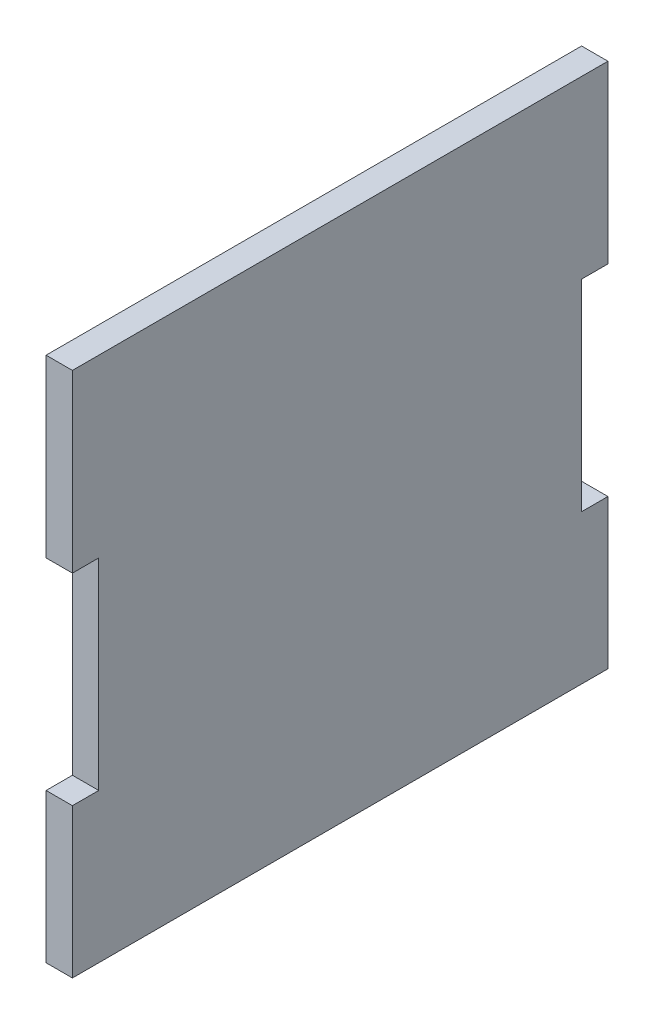
ISO-10303-21;
HEADER;
FILE_DESCRIPTION(('STEP AP214'),'2;1');
FILE_NAME('part.step','',(''),(''),'','','');
FILE_SCHEMA(('AUTOMOTIVE_DESIGN { 1 0 10303 214 1 1 1 1 }'));
ENDSEC;
DATA;
#1=APPLICATION_CONTEXT('core data for automotive mechanical design processes');
#2=APPLICATION_PROTOCOL_DEFINITION('international standard','automotive_design',2000,#1);
#3=PRODUCT_CONTEXT('',#1,'mechanical');
#4=PRODUCT('Part','Part','',(#3));
#5=PRODUCT_RELATED_PRODUCT_CATEGORY('part','',(#4));
#6=PRODUCT_DEFINITION_FORMATION('','',#4);
#7=PRODUCT_DEFINITION_CONTEXT('part definition',#1,'design');
#8=PRODUCT_DEFINITION('design','',#6,#7);
#9=PRODUCT_DEFINITION_SHAPE('','',#8);
#10=(LENGTH_UNIT() NAMED_UNIT(*) SI_UNIT(.MILLI.,.METRE.));
#11=(NAMED_UNIT(*) PLANE_ANGLE_UNIT() SI_UNIT($,.RADIAN.));
#12=(NAMED_UNIT(*) SI_UNIT($,.STERADIAN.) SOLID_ANGLE_UNIT());
#13=UNCERTAINTY_MEASURE_WITH_UNIT(LENGTH_MEASURE(1.E-05),#10,'distance_accuracy_value','');
#14=(GEOMETRIC_REPRESENTATION_CONTEXT(3) GLOBAL_UNCERTAINTY_ASSIGNED_CONTEXT((#13)) GLOBAL_UNIT_ASSIGNED_CONTEXT((#10,
#11,#12)) REPRESENTATION_CONTEXT('',''));
#15=CARTESIAN_POINT('',(0.,0.,0.));
#16=DIRECTION('',(0.,0.,1.));
#17=DIRECTION('',(1.,0.,0.));
#18=AXIS2_PLACEMENT_3D('',#15,#16,#17);
#19=CARTESIAN_POINT('',(3.,0.,-30.5));
#20=DIRECTION('',(0.,0.,1.));
#21=DIRECTION('',(1.,0.,0.));
#22=AXIS2_PLACEMENT_3D('',#19,#20,#21);
#23=PLANE('',#22);
#24=DIRECTION('',(0.,1.,0.));
#25=VECTOR('',#24,1.);
#26=CARTESIAN_POINT('',(0.,0.,-30.5));
#27=LINE('',#26,#25);
#28=CARTESIAN_POINT('',(0.,0.,-30.5));
#29=VERTEX_POINT('',#28);
#30=CARTESIAN_POINT('',(0.,17.,-30.5));
#31=VERTEX_POINT('',#30);
#32=EDGE_CURVE('E162',#29,#31,#27,.T.);
#33=ORIENTED_EDGE('',*,*,#32,.T.);
#34=DIRECTION('',(-1.,0.,0.));
#35=VECTOR('',#34,1.);
#36=CARTESIAN_POINT('',(3.,17.,-30.5));
#37=LINE('',#36,#35);
#38=CARTESIAN_POINT('',(3.,17.,-30.5));
#39=VERTEX_POINT('',#38);
#40=EDGE_CURVE('E45',#39,#31,#37,.T.);
#41=ORIENTED_EDGE('',*,*,#40,.F.);
#42=DIRECTION('',(0.,1.,0.));
#43=VECTOR('',#42,1.);
#44=CARTESIAN_POINT('',(3.,0.,-30.5));
#45=LINE('',#44,#43);
#46=CARTESIAN_POINT('',(3.,0.,-30.5));
#47=VERTEX_POINT('',#46);
#48=EDGE_CURVE('E110',#47,#39,#45,.T.);
#49=ORIENTED_EDGE('',*,*,#48,.F.);
#50=DIRECTION('',(-1.,0.,0.));
#51=VECTOR('',#50,1.);
#52=CARTESIAN_POINT('',(3.,0.,-30.5));
#53=LINE('',#52,#51);
#54=EDGE_CURVE('E11',#47,#29,#53,.T.);
#55=ORIENTED_EDGE('',*,*,#54,.T.);
#56=EDGE_LOOP('',(#33,#41,#49,#55));
#57=FACE_BOUND('',#56,.T.);
#58=ADVANCED_FACE('F37',(#57),#23,.F.);
#59=CARTESIAN_POINT('',(3.,17.,-27.5));
#60=DIRECTION('',(0.,-1.,0.));
#61=DIRECTION('',(0.,0.,-1.));
#62=AXIS2_PLACEMENT_3D('',#59,#60,#61);
#63=PLANE('',#62);
#64=DIRECTION('',(0.,0.,1.));
#65=VECTOR('',#64,1.);
#66=CARTESIAN_POINT('',(0.,17.,-27.5));
#67=LINE('',#66,#65);
#68=CARTESIAN_POINT('',(0.,17.,-27.5));
#69=VERTEX_POINT('',#68);
#70=EDGE_CURVE('E164',#31,#69,#67,.T.);
#71=ORIENTED_EDGE('',*,*,#70,.T.);
#72=DIRECTION('',(-1.,0.,0.));
#73=VECTOR('',#72,1.);
#74=CARTESIAN_POINT('',(3.,17.,-27.5));
#75=LINE('',#74,#73);
#76=CARTESIAN_POINT('',(3.,17.,-27.5));
#77=VERTEX_POINT('',#76);
#78=EDGE_CURVE('E202',#77,#69,#75,.T.);
#79=ORIENTED_EDGE('',*,*,#78,.F.);
#80=DIRECTION('',(0.,0.,1.));
#81=VECTOR('',#80,1.);
#82=CARTESIAN_POINT('',(3.,17.,-27.5));
#83=LINE('',#82,#81);
#84=EDGE_CURVE('E210',#39,#77,#83,.T.);
#85=ORIENTED_EDGE('',*,*,#84,.F.);
#86=ORIENTED_EDGE('',*,*,#40,.T.);
#87=EDGE_LOOP('',(#71,#79,#85,#86));
#88=FACE_BOUND('',#87,.T.);
#89=ADVANCED_FACE('F208',(#88),#63,.F.);
#90=CARTESIAN_POINT('',(3.,17.,-27.5));
#91=DIRECTION('',(0.,0.,1.));
#92=DIRECTION('',(1.,0.,0.));
#93=AXIS2_PLACEMENT_3D('',#90,#91,#92);
#94=PLANE('',#93);
#95=DIRECTION('',(0.,1.,0.));
#96=VECTOR('',#95,1.);
#97=CARTESIAN_POINT('',(0.,17.,-27.5));
#98=LINE('',#97,#96);
#99=CARTESIAN_POINT('',(0.,39.94,-27.5));
#100=VERTEX_POINT('',#99);
#101=EDGE_CURVE('E166',#69,#100,#98,.T.);
#102=ORIENTED_EDGE('',*,*,#101,.T.);
#103=DIRECTION('',(-1.,0.,0.));
#104=VECTOR('',#103,1.);
#105=CARTESIAN_POINT('',(3.,39.94,-27.5));
#106=LINE('',#105,#104);
#107=CARTESIAN_POINT('',(3.,39.94,-27.5));
#108=VERTEX_POINT('',#107);
#109=EDGE_CURVE('E199',#108,#100,#106,.T.);
#110=ORIENTED_EDGE('',*,*,#109,.F.);
#111=DIRECTION('',(0.,1.,0.));
#112=VECTOR('',#111,1.);
#113=CARTESIAN_POINT('',(3.,17.,-27.5));
#114=LINE('',#113,#112);
#115=EDGE_CURVE('E226',#77,#108,#114,.T.);
#116=ORIENTED_EDGE('',*,*,#115,.F.);
#117=ORIENTED_EDGE('',*,*,#78,.T.);
#118=EDGE_LOOP('',(#102,#110,#116,#117));
#119=FACE_BOUND('',#118,.T.);
#120=ADVANCED_FACE('F217',(#119),#94,.F.);
#121=CARTESIAN_POINT('',(3.,39.94,-30.5));
#122=DIRECTION('',(0.,1.,0.));
#123=DIRECTION('',(0.,0.,1.));
#124=AXIS2_PLACEMENT_3D('',#121,#122,#123);
#125=PLANE('',#124);
#126=DIRECTION('',(0.,0.,-1.));
#127=VECTOR('',#126,1.);
#128=CARTESIAN_POINT('',(0.,39.94,-30.5));
#129=LINE('',#128,#127);
#130=CARTESIAN_POINT('',(0.,39.94,-30.5));
#131=VERTEX_POINT('',#130);
#132=EDGE_CURVE('E168',#100,#131,#129,.T.);
#133=ORIENTED_EDGE('',*,*,#132,.T.);
#134=DIRECTION('',(-1.,0.,0.));
#135=VECTOR('',#134,1.);
#136=CARTESIAN_POINT('',(3.,39.94,-30.5));
#137=LINE('',#136,#135);
#138=CARTESIAN_POINT('',(3.,39.94,-30.5));
#139=VERTEX_POINT('',#138);
#140=EDGE_CURVE('E196',#139,#131,#137,.T.);
#141=ORIENTED_EDGE('',*,*,#140,.F.);
#142=DIRECTION('',(0.,0.,-1.));
#143=VECTOR('',#142,1.);
#144=CARTESIAN_POINT('',(3.,39.94,-30.5));
#145=LINE('',#144,#143);
#146=EDGE_CURVE('E223',#108,#139,#145,.T.);
#147=ORIENTED_EDGE('',*,*,#146,.F.);
#148=ORIENTED_EDGE('',*,*,#109,.T.);
#149=EDGE_LOOP('',(#133,#141,#147,#148));
#150=FACE_BOUND('',#149,.T.);
#151=ADVANCED_FACE('F221',(#150),#125,.F.);
#152=CARTESIAN_POINT('',(3.,39.94,-30.5));
#153=DIRECTION('',(0.,0.,1.));
#154=DIRECTION('',(1.,0.,0.));
#155=AXIS2_PLACEMENT_3D('',#152,#153,#154);
#156=PLANE('',#155);
#157=DIRECTION('',(0.,1.,0.));
#158=VECTOR('',#157,1.);
#159=CARTESIAN_POINT('',(0.,39.94,-30.5));
#160=LINE('',#159,#158);
#161=CARTESIAN_POINT('',(0.,59.94,-30.5));
#162=VERTEX_POINT('',#161);
#163=EDGE_CURVE('E170',#131,#162,#160,.T.);
#164=ORIENTED_EDGE('',*,*,#163,.T.);
#165=DIRECTION('',(-1.,0.,0.));
#166=VECTOR('',#165,1.);
#167=CARTESIAN_POINT('',(3.,59.94,-30.5));
#168=LINE('',#167,#166);
#169=CARTESIAN_POINT('',(3.,59.94,-30.5));
#170=VERTEX_POINT('',#169);
#171=EDGE_CURVE('E193',#170,#162,#168,.T.);
#172=ORIENTED_EDGE('',*,*,#171,.F.);
#173=DIRECTION('',(0.,1.,0.));
#174=VECTOR('',#173,1.);
#175=CARTESIAN_POINT('',(3.,39.94,-30.5));
#176=LINE('',#175,#174);
#177=EDGE_CURVE('E225',#139,#170,#176,.T.);
#178=ORIENTED_EDGE('',*,*,#177,.F.);
#179=ORIENTED_EDGE('',*,*,#140,.T.);
#180=EDGE_LOOP('',(#164,#172,#178,#179));
#181=FACE_BOUND('',#180,.T.);
#182=ADVANCED_FACE('F260',(#181),#156,.F.);
#183=CARTESIAN_POINT('',(3.,59.94,30.5));
#184=DIRECTION('',(0.,-1.,0.));
#185=DIRECTION('',(0.,0.,-1.));
#186=AXIS2_PLACEMENT_3D('',#183,#184,#185);
#187=PLANE('',#186);
#188=DIRECTION('',(0.,0.,1.));
#189=VECTOR('',#188,1.);
#190=CARTESIAN_POINT('',(0.,59.94,30.5));
#191=LINE('',#190,#189);
#192=CARTESIAN_POINT('',(0.,59.94,30.5));
#193=VERTEX_POINT('',#192);
#194=EDGE_CURVE('E173',#162,#193,#191,.T.);
#195=ORIENTED_EDGE('',*,*,#194,.T.);
#196=DIRECTION('',(-1.,0.,0.));
#197=VECTOR('',#196,1.);
#198=CARTESIAN_POINT('',(3.,59.94,30.5));
#199=LINE('',#198,#197);
#200=CARTESIAN_POINT('',(3.,59.94,30.5));
#201=VERTEX_POINT('',#200);
#202=EDGE_CURVE('E190',#201,#193,#199,.T.);
#203=ORIENTED_EDGE('',*,*,#202,.F.);
#204=DIRECTION('',(0.,0.,1.));
#205=VECTOR('',#204,1.);
#206=CARTESIAN_POINT('',(3.,59.94,-30.5));
#207=LINE('',#206,#205);
#208=EDGE_CURVE('E228',#170,#201,#207,.T.);
#209=ORIENTED_EDGE('',*,*,#208,.F.);
#210=ORIENTED_EDGE('',*,*,#171,.T.);
#211=EDGE_LOOP('',(#195,#203,#209,#210));
#212=FACE_BOUND('',#211,.T.);
#213=ADVANCED_FACE('F263',(#212),#187,.F.);
#214=CARTESIAN_POINT('',(3.,39.94,30.5));
#215=DIRECTION('',(0.,0.,-1.));
#216=DIRECTION('',(0.,1.,0.));
#217=AXIS2_PLACEMENT_3D('',#214,#215,#216);
#218=PLANE('',#217);
#219=DIRECTION('',(0.,-1.,0.));
#220=VECTOR('',#219,1.);
#221=CARTESIAN_POINT('',(0.,39.94,30.5));
#222=LINE('',#221,#220);
#223=CARTESIAN_POINT('',(0.,39.94,30.5));
#224=VERTEX_POINT('',#223);
#225=EDGE_CURVE('E175',#193,#224,#222,.T.);
#226=ORIENTED_EDGE('',*,*,#225,.T.);
#227=DIRECTION('',(-1.,0.,0.));
#228=VECTOR('',#227,1.);
#229=CARTESIAN_POINT('',(3.,39.94,30.5));
#230=LINE('',#229,#228);
#231=CARTESIAN_POINT('',(3.,39.94,30.5));
#232=VERTEX_POINT('',#231);
#233=EDGE_CURVE('E187',#232,#224,#230,.T.);
#234=ORIENTED_EDGE('',*,*,#233,.F.);
#235=DIRECTION('',(0.,-1.,0.));
#236=VECTOR('',#235,1.);
#237=CARTESIAN_POINT('',(3.,39.94,30.5));
#238=LINE('',#237,#236);
#239=EDGE_CURVE('E234',#201,#232,#238,.T.);
#240=ORIENTED_EDGE('',*,*,#239,.F.);
#241=ORIENTED_EDGE('',*,*,#202,.T.);
#242=EDGE_LOOP('',(#226,#234,#240,#241));
#243=FACE_BOUND('',#242,.T.);
#244=ADVANCED_FACE('F240',(#243),#218,.F.);
#245=CARTESIAN_POINT('',(3.,39.94,30.5));
#246=DIRECTION('',(0.,1.,0.));
#247=DIRECTION('',(0.,0.,1.));
#248=AXIS2_PLACEMENT_3D('',#245,#246,#247);
#249=PLANE('',#248);
#250=DIRECTION('',(0.,0.,-1.));
#251=VECTOR('',#250,1.);
#252=CARTESIAN_POINT('',(0.,39.94,30.5));
#253=LINE('',#252,#251);
#254=CARTESIAN_POINT('',(0.,39.94,27.5));
#255=VERTEX_POINT('',#254);
#256=EDGE_CURVE('E177',#224,#255,#253,.T.);
#257=ORIENTED_EDGE('',*,*,#256,.T.);
#258=DIRECTION('',(-1.,0.,0.));
#259=VECTOR('',#258,1.);
#260=CARTESIAN_POINT('',(3.,39.94,27.5));
#261=LINE('',#260,#259);
#262=CARTESIAN_POINT('',(3.,39.94,27.5));
#263=VERTEX_POINT('',#262);
#264=EDGE_CURVE('E151',#263,#255,#261,.T.);
#265=ORIENTED_EDGE('',*,*,#264,.F.);
#266=DIRECTION('',(0.,0.,-1.));
#267=VECTOR('',#266,1.);
#268=CARTESIAN_POINT('',(3.,39.94,30.5));
#269=LINE('',#268,#267);
#270=EDGE_CURVE('E142',#232,#263,#269,.T.);
#271=ORIENTED_EDGE('',*,*,#270,.F.);
#272=ORIENTED_EDGE('',*,*,#233,.T.);
#273=EDGE_LOOP('',(#257,#265,#271,#272));
#274=FACE_BOUND('',#273,.T.);
#275=ADVANCED_FACE('F244',(#274),#249,.F.);
#276=CARTESIAN_POINT('',(3.,17.,27.5));
#277=DIRECTION('',(0.,0.,-1.));
#278=DIRECTION('',(0.,1.,0.));
#279=AXIS2_PLACEMENT_3D('',#276,#277,#278);
#280=PLANE('',#279);
#281=DIRECTION('',(0.,-1.,0.));
#282=VECTOR('',#281,1.);
#283=CARTESIAN_POINT('',(0.,17.,27.5));
#284=LINE('',#283,#282);
#285=CARTESIAN_POINT('',(0.,17.,27.5));
#286=VERTEX_POINT('',#285);
#287=EDGE_CURVE('E150',#255,#286,#284,.T.);
#288=ORIENTED_EDGE('',*,*,#287,.T.);
#289=DIRECTION('',(-1.,0.,0.));
#290=VECTOR('',#289,1.);
#291=CARTESIAN_POINT('',(3.,17.,27.5));
#292=LINE('',#291,#290);
#293=CARTESIAN_POINT('',(3.,17.,27.5));
#294=VERTEX_POINT('',#293);
#295=EDGE_CURVE('E147',#294,#286,#292,.T.);
#296=ORIENTED_EDGE('',*,*,#295,.F.);
#297=DIRECTION('',(0.,-1.,0.));
#298=VECTOR('',#297,1.);
#299=CARTESIAN_POINT('',(3.,17.,27.5));
#300=LINE('',#299,#298);
#301=EDGE_CURVE('E136',#263,#294,#300,.T.);
#302=ORIENTED_EDGE('',*,*,#301,.F.);
#303=ORIENTED_EDGE('',*,*,#264,.T.);
#304=EDGE_LOOP('',(#288,#296,#302,#303));
#305=FACE_BOUND('',#304,.T.);
#306=ADVANCED_FACE('F148',(#305),#280,.F.);
#307=CARTESIAN_POINT('',(3.,17.,27.5));
#308=DIRECTION('',(0.,-1.,0.));
#309=DIRECTION('',(0.,0.,-1.));
#310=AXIS2_PLACEMENT_3D('',#307,#308,#309);
#311=PLANE('',#310);
#312=DIRECTION('',(0.,0.,1.));
#313=VECTOR('',#312,1.);
#314=CARTESIAN_POINT('',(0.,17.,27.5));
#315=LINE('',#314,#313);
#316=CARTESIAN_POINT('',(0.,17.,30.5));
#317=VERTEX_POINT('',#316);
#318=EDGE_CURVE('E95',#286,#317,#315,.T.);
#319=ORIENTED_EDGE('',*,*,#318,.T.);
#320=DIRECTION('',(-1.,0.,0.));
#321=VECTOR('',#320,1.);
#322=CARTESIAN_POINT('',(3.,17.,30.5));
#323=LINE('',#322,#321);
#324=CARTESIAN_POINT('',(3.,17.,30.5));
#325=VERTEX_POINT('',#324);
#326=EDGE_CURVE('E152',#325,#317,#323,.T.);
#327=ORIENTED_EDGE('',*,*,#326,.F.);
#328=DIRECTION('',(0.,0.,1.));
#329=VECTOR('',#328,1.);
#330=CARTESIAN_POINT('',(3.,17.,27.5));
#331=LINE('',#330,#329);
#332=EDGE_CURVE('E140',#294,#325,#331,.T.);
#333=ORIENTED_EDGE('',*,*,#332,.F.);
#334=ORIENTED_EDGE('',*,*,#295,.T.);
#335=EDGE_LOOP('',(#319,#327,#333,#334));
#336=FACE_BOUND('',#335,.T.);
#337=ADVANCED_FACE('F154',(#336),#311,.F.);
#338=CARTESIAN_POINT('',(3.,0.,30.5));
#339=DIRECTION('',(0.,0.,-1.));
#340=DIRECTION('',(-1.,0.,0.));
#341=AXIS2_PLACEMENT_3D('',#338,#339,#340);
#342=PLANE('',#341);
#343=DIRECTION('',(0.,-1.,0.));
#344=VECTOR('',#343,1.);
#345=CARTESIAN_POINT('',(0.,0.,30.5));
#346=LINE('',#345,#344);
#347=CARTESIAN_POINT('',(0.,0.,30.5));
#348=VERTEX_POINT('',#347);
#349=EDGE_CURVE('E181',#317,#348,#346,.T.);
#350=ORIENTED_EDGE('',*,*,#349,.T.);
#351=DIRECTION('',(-1.,0.,0.));
#352=VECTOR('',#351,1.);
#353=CARTESIAN_POINT('',(3.,0.,30.5));
#354=LINE('',#353,#352);
#355=CARTESIAN_POINT('',(3.,0.,30.5));
#356=VERTEX_POINT('',#355);
#357=EDGE_CURVE('E158',#356,#348,#354,.T.);
#358=ORIENTED_EDGE('',*,*,#357,.F.);
#359=DIRECTION('',(0.,-1.,0.));
#360=VECTOR('',#359,1.);
#361=CARTESIAN_POINT('',(3.,0.,30.5));
#362=LINE('',#361,#360);
#363=EDGE_CURVE('E156',#325,#356,#362,.T.);
#364=ORIENTED_EDGE('',*,*,#363,.F.);
#365=ORIENTED_EDGE('',*,*,#326,.T.);
#366=EDGE_LOOP('',(#350,#358,#364,#365));
#367=FACE_BOUND('',#366,.T.);
#368=ADVANCED_FACE('F247',(#367),#342,.F.);
#369=CARTESIAN_POINT('',(3.,0.,27.5));
#370=DIRECTION('',(0.,1.,0.));
#371=DIRECTION('',(0.,0.,1.));
#372=AXIS2_PLACEMENT_3D('',#369,#370,#371);
#373=PLANE('',#372);
#374=DIRECTION('',(0.,0.,-1.));
#375=VECTOR('',#374,1.);
#376=CARTESIAN_POINT('',(0.,0.,27.5));
#377=LINE('',#376,#375);
#378=EDGE_CURVE('E102',#348,#29,#377,.T.);
#379=ORIENTED_EDGE('',*,*,#378,.T.);
#380=ORIENTED_EDGE('',*,*,#54,.F.);
#381=DIRECTION('',(0.,0.,-1.));
#382=VECTOR('',#381,1.);
#383=CARTESIAN_POINT('',(3.,0.,-27.5));
#384=LINE('',#383,#382);
#385=EDGE_CURVE('E53',#356,#47,#384,.T.);
#386=ORIENTED_EDGE('',*,*,#385,.F.);
#387=ORIENTED_EDGE('',*,*,#357,.T.);
#388=EDGE_LOOP('',(#379,#380,#386,#387));
#389=FACE_BOUND('',#388,.T.);
#390=ADVANCED_FACE('F248',(#389),#373,.F.);
#391=CARTESIAN_POINT('',(3.,0.,0.));
#392=DIRECTION('',(1.,0.,0.));
#393=DIRECTION('',(0.,0.,-1.));
#394=AXIS2_PLACEMENT_3D('',#391,#392,#393);
#395=PLANE('',#394);
#396=ORIENTED_EDGE('',*,*,#385,.T.);
#397=ORIENTED_EDGE('',*,*,#48,.T.);
#398=ORIENTED_EDGE('',*,*,#84,.T.);
#399=ORIENTED_EDGE('',*,*,#115,.T.);
#400=ORIENTED_EDGE('',*,*,#146,.T.);
#401=ORIENTED_EDGE('',*,*,#177,.T.);
#402=ORIENTED_EDGE('',*,*,#208,.T.);
#403=ORIENTED_EDGE('',*,*,#239,.T.);
#404=ORIENTED_EDGE('',*,*,#270,.T.);
#405=ORIENTED_EDGE('',*,*,#301,.T.);
#406=ORIENTED_EDGE('',*,*,#332,.T.);
#407=ORIENTED_EDGE('',*,*,#363,.T.);
#408=EDGE_LOOP('',(#396,#397,#398,#399,#400,#401,#402,#403,#404,#405,#406,#407));
#409=FACE_BOUND('',#408,.T.);
#410=ADVANCED_FACE('F138',(#409),#395,.T.);
#411=CARTESIAN_POINT('',(0.,0.,0.));
#412=DIRECTION('',(1.,0.,0.));
#413=DIRECTION('',(0.,0.,-1.));
#414=AXIS2_PLACEMENT_3D('',#411,#412,#413);
#415=PLANE('',#414);
#416=ORIENTED_EDGE('',*,*,#32,.F.);
#417=ORIENTED_EDGE('',*,*,#378,.F.);
#418=ORIENTED_EDGE('',*,*,#349,.F.);
#419=ORIENTED_EDGE('',*,*,#318,.F.);
#420=ORIENTED_EDGE('',*,*,#287,.F.);
#421=ORIENTED_EDGE('',*,*,#256,.F.);
#422=ORIENTED_EDGE('',*,*,#225,.F.);
#423=ORIENTED_EDGE('',*,*,#194,.F.);
#424=ORIENTED_EDGE('',*,*,#163,.F.);
#425=ORIENTED_EDGE('',*,*,#132,.F.);
#426=ORIENTED_EDGE('',*,*,#101,.F.);
#427=ORIENTED_EDGE('',*,*,#70,.F.);
#428=EDGE_LOOP('',(#416,#417,#418,#419,#420,#421,#422,#423,#424,#425,#426,#427));
#429=FACE_BOUND('',#428,.T.);
#430=ADVANCED_FACE('F212',(#429),#415,.F.);
#431=CLOSED_SHELL('',(#58,#89,#120,#151,#182,#213,#244,#275,#306,#337,#368,#390,#410,#430));
#432=MANIFOLD_SOLID_BREP('B2',#431);
#433=ADVANCED_BREP_SHAPE_REPRESENTATION('',(#18,#432),#14);
#434=SHAPE_DEFINITION_REPRESENTATION(#9,#433);
ENDSEC;
END-ISO-10303-21;
